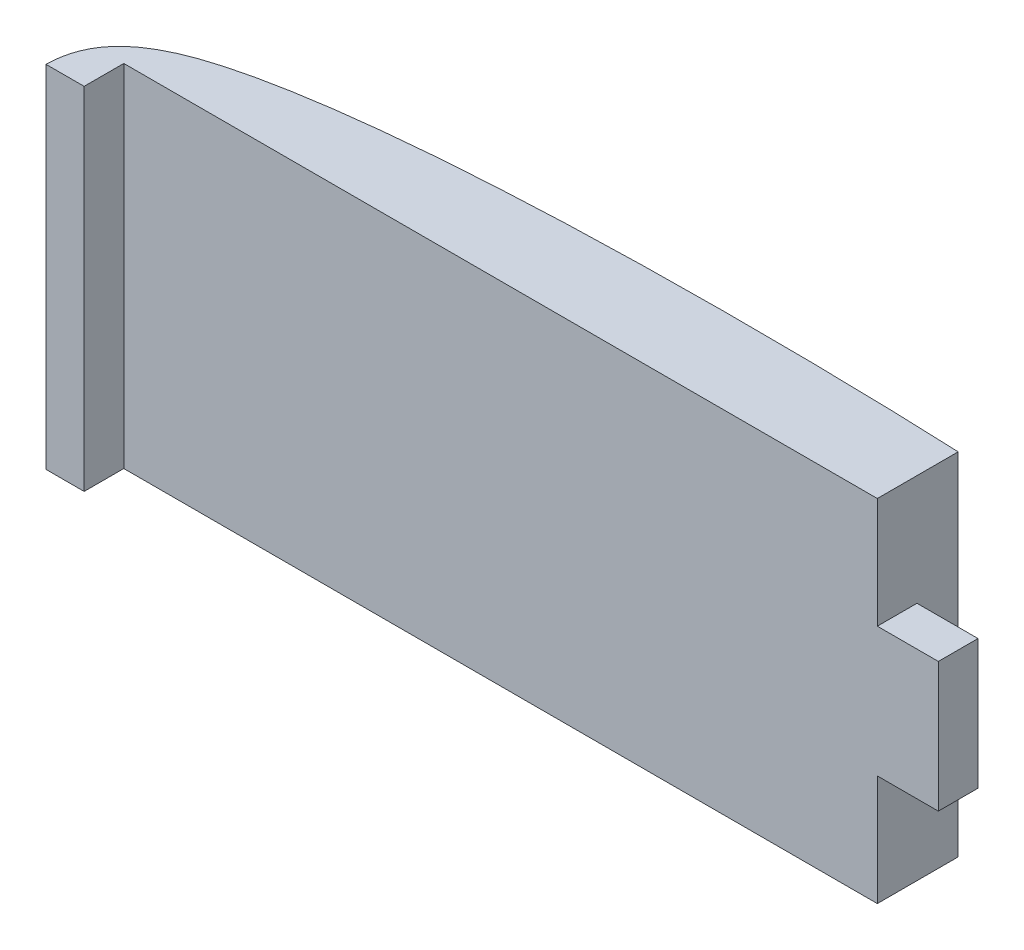
ISO-10303-21;
HEADER;
FILE_DESCRIPTION(('STEP AP214'),'2;1');
FILE_NAME('part.step','',(''),(''),'','','');
FILE_SCHEMA(('AUTOMOTIVE_DESIGN { 1 0 10303 214 1 1 1 1 }'));
ENDSEC;
DATA;
#1=APPLICATION_CONTEXT('core data for automotive mechanical design processes');
#2=APPLICATION_PROTOCOL_DEFINITION('international standard','automotive_design',2000,#1);
#3=PRODUCT_CONTEXT('',#1,'mechanical');
#4=PRODUCT('Part','Part','',(#3));
#5=PRODUCT_RELATED_PRODUCT_CATEGORY('part','',(#4));
#6=PRODUCT_DEFINITION_FORMATION('','',#4);
#7=PRODUCT_DEFINITION_CONTEXT('part definition',#1,'design');
#8=PRODUCT_DEFINITION('design','',#6,#7);
#9=PRODUCT_DEFINITION_SHAPE('','',#8);
#10=(LENGTH_UNIT() NAMED_UNIT(*) SI_UNIT(.MILLI.,.METRE.));
#11=(NAMED_UNIT(*) PLANE_ANGLE_UNIT() SI_UNIT($,.RADIAN.));
#12=(NAMED_UNIT(*) SI_UNIT($,.STERADIAN.) SOLID_ANGLE_UNIT());
#13=UNCERTAINTY_MEASURE_WITH_UNIT(LENGTH_MEASURE(1.E-05),#10,'distance_accuracy_value','');
#14=(GEOMETRIC_REPRESENTATION_CONTEXT(3) GLOBAL_UNCERTAINTY_ASSIGNED_CONTEXT((#13)) GLOBAL_UNIT_ASSIGNED_CONTEXT((#10,
#11,#12)) REPRESENTATION_CONTEXT('',''));
#15=CARTESIAN_POINT('',(0.,0.,0.));
#16=DIRECTION('',(0.,0.,1.));
#17=DIRECTION('',(1.,0.,0.));
#18=AXIS2_PLACEMENT_3D('',#15,#16,#17);
#19=CARTESIAN_POINT('',(0.,23.,0.));
#20=DIRECTION('',(-1.,0.,0.));
#21=DIRECTION('',(0.,0.,1.));
#22=AXIS2_PLACEMENT_3D('',#19,#20,#21);
#23=PLANE('',#22);
#24=DIRECTION('',(0.,0.,1.));
#25=VECTOR('',#24,1.);
#26=CARTESIAN_POINT('',(0.,15.75,-2.6));
#27=LINE('',#26,#25);
#28=CARTESIAN_POINT('',(0.,15.75,-2.6));
#29=VERTEX_POINT('',#28);
#30=CARTESIAN_POINT('',(0.,15.75,0.));
#31=VERTEX_POINT('',#30);
#32=EDGE_CURVE('E49',#29,#31,#27,.T.);
#33=ORIENTED_EDGE('',*,*,#32,.F.);
#34=DIRECTION('',(0.,1.,0.));
#35=VECTOR('',#34,1.);
#36=CARTESIAN_POINT('',(0.,7.25,-2.6));
#37=LINE('',#36,#35);
#38=CARTESIAN_POINT('',(0.,7.25,-2.6));
#39=VERTEX_POINT('',#38);
#40=EDGE_CURVE('E124',#39,#29,#37,.T.);
#41=ORIENTED_EDGE('',*,*,#40,.F.);
#42=DIRECTION('',(0.,0.,-1.));
#43=VECTOR('',#42,1.);
#44=CARTESIAN_POINT('',(0.,7.25,0.));
#45=LINE('',#44,#43);
#46=CARTESIAN_POINT('',(0.,7.25,0.));
#47=VERTEX_POINT('',#46);
#48=EDGE_CURVE('E55',#47,#39,#45,.T.);
#49=ORIENTED_EDGE('',*,*,#48,.F.);
#50=DIRECTION('',(0.,-1.,0.));
#51=VECTOR('',#50,1.);
#52=CARTESIAN_POINT('',(0.,23.,0.));
#53=LINE('',#52,#51);
#54=CARTESIAN_POINT('',(0.,0.,0.));
#55=VERTEX_POINT('',#54);
#56=EDGE_CURVE('E43',#47,#55,#53,.T.);
#57=ORIENTED_EDGE('',*,*,#56,.T.);
#58=DIRECTION('',(0.,0.,-1.));
#59=VECTOR('',#58,1.);
#60=CARTESIAN_POINT('',(0.,0.,0.));
#61=LINE('',#60,#59);
#62=CARTESIAN_POINT('',(0.,0.,-5.3));
#63=VERTEX_POINT('',#62);
#64=EDGE_CURVE('E129',#55,#63,#61,.T.);
#65=ORIENTED_EDGE('',*,*,#64,.T.);
#66=DIRECTION('',(0.,-1.,0.));
#67=VECTOR('',#66,1.);
#68=CARTESIAN_POINT('',(0.,23.,-5.3));
#69=LINE('',#68,#67);
#70=CARTESIAN_POINT('',(0.,23.,-5.3));
#71=VERTEX_POINT('',#70);
#72=EDGE_CURVE('E283',#71,#63,#69,.T.);
#73=ORIENTED_EDGE('',*,*,#72,.F.);
#74=DIRECTION('',(0.,0.,-1.));
#75=VECTOR('',#74,1.);
#76=CARTESIAN_POINT('',(0.,23.,0.));
#77=LINE('',#76,#75);
#78=CARTESIAN_POINT('',(0.,23.,0.));
#79=VERTEX_POINT('',#78);
#80=EDGE_CURVE('E138',#79,#71,#77,.T.);
#81=ORIENTED_EDGE('',*,*,#80,.F.);
#82=EDGE_CURVE('E11',#79,#31,#53,.T.);
#83=ORIENTED_EDGE('',*,*,#82,.T.);
#84=EDGE_LOOP('',(#33,#41,#49,#57,#65,#73,#81,#83));
#85=FACE_BOUND('',#84,.T.);
#86=ADVANCED_FACE('F35',(#85),#23,.F.);
#87=CARTESIAN_POINT('',(0.,23.,0.));
#88=DIRECTION('',(0.,0.,-1.));
#89=DIRECTION('',(-1.,0.,0.));
#90=AXIS2_PLACEMENT_3D('',#87,#88,#89);
#91=PLANE('',#90);
#92=DIRECTION('',(1.,0.,0.));
#93=VECTOR('',#92,1.);
#94=CARTESIAN_POINT('',(0.,0.,0.));
#95=LINE('',#94,#93);
#96=CARTESIAN_POINT('',(-49.4,0.,0.));
#97=VERTEX_POINT('',#96);
#98=EDGE_CURVE('E127',#97,#55,#95,.T.);
#99=ORIENTED_EDGE('',*,*,#98,.T.);
#100=ORIENTED_EDGE('',*,*,#56,.F.);
#101=DIRECTION('',(-1.,0.,0.));
#102=VECTOR('',#101,1.);
#103=CARTESIAN_POINT('',(4.,7.25,0.));
#104=LINE('',#103,#102);
#105=CARTESIAN_POINT('',(4.,7.25,0.));
#106=VERTEX_POINT('',#105);
#107=EDGE_CURVE('E111',#106,#47,#104,.T.);
#108=ORIENTED_EDGE('',*,*,#107,.F.);
#109=DIRECTION('',(0.,-1.,0.));
#110=VECTOR('',#109,1.);
#111=CARTESIAN_POINT('',(4.,15.75,0.));
#112=LINE('',#111,#110);
#113=CARTESIAN_POINT('',(4.,15.75,0.));
#114=VERTEX_POINT('',#113);
#115=EDGE_CURVE('E104',#114,#106,#112,.T.);
#116=ORIENTED_EDGE('',*,*,#115,.F.);
#117=DIRECTION('',(-1.,0.,0.));
#118=VECTOR('',#117,1.);
#119=CARTESIAN_POINT('',(4.,15.75,0.));
#120=LINE('',#119,#118);
#121=EDGE_CURVE('E109',#114,#31,#120,.T.);
#122=ORIENTED_EDGE('',*,*,#121,.T.);
#123=ORIENTED_EDGE('',*,*,#82,.F.);
#124=DIRECTION('',(1.,0.,0.));
#125=VECTOR('',#124,1.);
#126=CARTESIAN_POINT('',(0.,23.,0.));
#127=LINE('',#126,#125);
#128=CARTESIAN_POINT('',(-49.4,23.,0.));
#129=VERTEX_POINT('',#128);
#130=EDGE_CURVE('E135',#129,#79,#127,.T.);
#131=ORIENTED_EDGE('',*,*,#130,.F.);
#132=DIRECTION('',(0.,-1.,0.));
#133=VECTOR('',#132,1.);
#134=CARTESIAN_POINT('',(-49.4,23.,0.));
#135=LINE('',#134,#133);
#136=EDGE_CURVE('E271',#129,#97,#135,.T.);
#137=ORIENTED_EDGE('',*,*,#136,.T.);
#138=EDGE_LOOP('',(#99,#100,#108,#116,#122,#123,#131,#137));
#139=FACE_BOUND('',#138,.T.);
#140=ADVANCED_FACE('F37',(#139),#91,.F.);
#141=CARTESIAN_POINT('',(0.,23.,-5.3));
#142=CARTESIAN_POINT('',(-7.99387446484531,23.,-5.66903910950247));
#143=CARTESIAN_POINT('',(-41.5732200263528,23.,-6.37256579237499));
#144=CARTESIAN_POINT('',(-51.8478477426027,23.,-0.984637076367036));
#145=CARTESIAN_POINT('',(-51.9,23.,2.60000000000009));
#146=B_SPLINE_CURVE_WITH_KNOTS('',3,(#141,#142,#143,#144,#145),.UNSPECIFIED.,.F.,.F.,(4,1,4),
(0.,0.717430519294495,1.),.UNSPECIFIED.);
#147=DIRECTION('',(0.,-1.,0.));
#148=VECTOR('',#147,1.);
#149=SURFACE_OF_LINEAR_EXTRUSION('',#146,#148);
#150=CARTESIAN_POINT('',(0.,0.,-5.3));
#151=CARTESIAN_POINT('',(-7.99387446484531,0.,-5.66903910950247));
#152=CARTESIAN_POINT('',(-41.5732200263528,0.,-6.37256579237499));
#153=CARTESIAN_POINT('',(-51.8478477426027,0.,-0.984637076367036));
#154=CARTESIAN_POINT('',(-51.9,0.,2.60000000000009));
#155=B_SPLINE_CURVE_WITH_KNOTS('',3,(#150,#151,#152,#153,#154),.UNSPECIFIED.,.F.,.F.,(4,1,4),
(0.,0.717430519294495,1.),.UNSPECIFIED.);
#156=CARTESIAN_POINT('',(-51.9,0.,2.60000000000009));
#157=VERTEX_POINT('',#156);
#158=EDGE_CURVE('E287',#63,#157,#155,.T.);
#159=ORIENTED_EDGE('',*,*,#158,.T.);
#160=DIRECTION('',(0.,-1.,0.));
#161=VECTOR('',#160,1.);
#162=CARTESIAN_POINT('',(-51.9,23.,2.60000000000009));
#163=LINE('',#162,#161);
#164=CARTESIAN_POINT('',(-51.9,23.,2.60000000000009));
#165=VERTEX_POINT('',#164);
#166=EDGE_CURVE('E277',#165,#157,#163,.T.);
#167=ORIENTED_EDGE('',*,*,#166,.F.);
#168=EDGE_CURVE('E141',#71,#165,#146,.T.);
#169=ORIENTED_EDGE('',*,*,#168,.F.);
#170=ORIENTED_EDGE('',*,*,#72,.T.);
#171=EDGE_LOOP('',(#159,#167,#169,#170));
#172=FACE_BOUND('',#171,.T.);
#173=ADVANCED_FACE('F152',(#172),#149,.F.);
#174=CARTESIAN_POINT('',(-49.4,23.,2.6));
#175=DIRECTION('',(0.,0.,-1.));
#176=DIRECTION('',(-1.,0.,0.));
#177=AXIS2_PLACEMENT_3D('',#174,#175,#176);
#178=PLANE('',#177);
#179=DIRECTION('',(1.,0.,0.));
#180=VECTOR('',#179,1.);
#181=CARTESIAN_POINT('',(-49.4,0.,2.6));
#182=LINE('',#181,#180);
#183=CARTESIAN_POINT('',(-49.4,0.,2.6));
#184=VERTEX_POINT('',#183);
#185=EDGE_CURVE('E289',#157,#184,#182,.T.);
#186=ORIENTED_EDGE('',*,*,#185,.T.);
#187=DIRECTION('',(0.,-1.,0.));
#188=VECTOR('',#187,1.);
#189=CARTESIAN_POINT('',(-49.4,23.,2.6));
#190=LINE('',#189,#188);
#191=CARTESIAN_POINT('',(-49.4,23.,2.6));
#192=VERTEX_POINT('',#191);
#193=EDGE_CURVE('E273',#192,#184,#190,.T.);
#194=ORIENTED_EDGE('',*,*,#193,.F.);
#195=DIRECTION('',(1.,0.,0.));
#196=VECTOR('',#195,1.);
#197=CARTESIAN_POINT('',(-49.4,23.,2.6));
#198=LINE('',#197,#196);
#199=EDGE_CURVE('E146',#165,#192,#198,.T.);
#200=ORIENTED_EDGE('',*,*,#199,.F.);
#201=ORIENTED_EDGE('',*,*,#166,.T.);
#202=EDGE_LOOP('',(#186,#194,#200,#201));
#203=FACE_BOUND('',#202,.T.);
#204=ADVANCED_FACE('F155',(#203),#178,.F.);
#205=CARTESIAN_POINT('',(-49.4,23.,0.));
#206=DIRECTION('',(-1.,0.,0.));
#207=DIRECTION('',(0.,0.,1.));
#208=AXIS2_PLACEMENT_3D('',#205,#206,#207);
#209=PLANE('',#208);
#210=DIRECTION('',(0.,0.,-1.));
#211=VECTOR('',#210,1.);
#212=CARTESIAN_POINT('',(-49.4,0.,0.));
#213=LINE('',#212,#211);
#214=EDGE_CURVE('E139',#184,#97,#213,.T.);
#215=ORIENTED_EDGE('',*,*,#214,.T.);
#216=ORIENTED_EDGE('',*,*,#136,.F.);
#217=DIRECTION('',(0.,0.,-1.));
#218=VECTOR('',#217,1.);
#219=CARTESIAN_POINT('',(-49.4,23.,0.));
#220=LINE('',#219,#218);
#221=EDGE_CURVE('E274',#192,#129,#220,.T.);
#222=ORIENTED_EDGE('',*,*,#221,.F.);
#223=ORIENTED_EDGE('',*,*,#193,.T.);
#224=EDGE_LOOP('',(#215,#216,#222,#223));
#225=FACE_BOUND('',#224,.T.);
#226=ADVANCED_FACE('F175',(#225),#209,.F.);
#227=CARTESIAN_POINT('',(-30.6596878631715,23.,-5.16204294580185));
#228=DIRECTION('',(0.,-1.,0.));
#229=DIRECTION('',(0.,0.,-1.));
#230=AXIS2_PLACEMENT_3D('',#227,#228,#229);
#231=PLANE('',#230);
#232=ORIENTED_EDGE('',*,*,#130,.T.);
#233=ORIENTED_EDGE('',*,*,#80,.T.);
#234=ORIENTED_EDGE('',*,*,#168,.T.);
#235=ORIENTED_EDGE('',*,*,#199,.T.);
#236=ORIENTED_EDGE('',*,*,#221,.T.);
#237=EDGE_LOOP('',(#232,#233,#234,#235,#236));
#238=FACE_BOUND('',#237,.T.);
#239=ADVANCED_FACE('F182',(#238),#231,.F.);
#240=CARTESIAN_POINT('',(-30.6596878631715,0.,-5.16204294580185));
#241=DIRECTION('',(0.,-1.,0.));
#242=DIRECTION('',(0.,0.,-1.));
#243=AXIS2_PLACEMENT_3D('',#240,#241,#242);
#244=PLANE('',#243);
#245=ORIENTED_EDGE('',*,*,#98,.F.);
#246=ORIENTED_EDGE('',*,*,#214,.F.);
#247=ORIENTED_EDGE('',*,*,#185,.F.);
#248=ORIENTED_EDGE('',*,*,#158,.F.);
#249=ORIENTED_EDGE('',*,*,#64,.F.);
#250=EDGE_LOOP('',(#245,#246,#247,#248,#249));
#251=FACE_BOUND('',#250,.T.);
#252=ADVANCED_FACE('F189',(#251),#244,.T.);
#253=CARTESIAN_POINT('',(4.,15.75,-2.6));
#254=DIRECTION('',(0.,-1.,0.));
#255=DIRECTION('',(0.,0.,-1.));
#256=AXIS2_PLACEMENT_3D('',#253,#254,#255);
#257=PLANE('',#256);
#258=ORIENTED_EDGE('',*,*,#32,.T.);
#259=ORIENTED_EDGE('',*,*,#121,.F.);
#260=DIRECTION('',(0.,0.,1.));
#261=VECTOR('',#260,1.);
#262=CARTESIAN_POINT('',(4.,15.75,-2.6));
#263=LINE('',#262,#261);
#264=CARTESIAN_POINT('',(4.,15.75,-2.6));
#265=VERTEX_POINT('',#264);
#266=EDGE_CURVE('E115',#265,#114,#263,.T.);
#267=ORIENTED_EDGE('',*,*,#266,.F.);
#268=DIRECTION('',(-1.,0.,0.));
#269=VECTOR('',#268,1.);
#270=CARTESIAN_POINT('',(4.,15.75,-2.6));
#271=LINE('',#270,#269);
#272=EDGE_CURVE('E255',#265,#29,#271,.T.);
#273=ORIENTED_EDGE('',*,*,#272,.T.);
#274=EDGE_LOOP('',(#258,#259,#267,#273));
#275=FACE_BOUND('',#274,.T.);
#276=ADVANCED_FACE('F126',(#275),#257,.F.);
#277=CARTESIAN_POINT('',(4.,7.25,0.));
#278=DIRECTION('',(0.,1.,0.));
#279=DIRECTION('',(0.,0.,1.));
#280=AXIS2_PLACEMENT_3D('',#277,#278,#279);
#281=PLANE('',#280);
#282=ORIENTED_EDGE('',*,*,#48,.T.);
#283=DIRECTION('',(-1.,0.,0.));
#284=VECTOR('',#283,1.);
#285=CARTESIAN_POINT('',(4.,7.25,-2.6));
#286=LINE('',#285,#284);
#287=CARTESIAN_POINT('',(4.,7.25,-2.6));
#288=VERTEX_POINT('',#287);
#289=EDGE_CURVE('E131',#288,#39,#286,.T.);
#290=ORIENTED_EDGE('',*,*,#289,.F.);
#291=DIRECTION('',(0.,0.,-1.));
#292=VECTOR('',#291,1.);
#293=CARTESIAN_POINT('',(4.,7.25,0.));
#294=LINE('',#293,#292);
#295=EDGE_CURVE('E114',#106,#288,#294,.T.);
#296=ORIENTED_EDGE('',*,*,#295,.F.);
#297=ORIENTED_EDGE('',*,*,#107,.T.);
#298=EDGE_LOOP('',(#282,#290,#296,#297));
#299=FACE_BOUND('',#298,.T.);
#300=ADVANCED_FACE('F203',(#299),#281,.F.);
#301=CARTESIAN_POINT('',(4.,7.25,-2.6));
#302=DIRECTION('',(0.,0.,1.));
#303=DIRECTION('',(1.,0.,0.));
#304=AXIS2_PLACEMENT_3D('',#301,#302,#303);
#305=PLANE('',#304);
#306=ORIENTED_EDGE('',*,*,#40,.T.);
#307=ORIENTED_EDGE('',*,*,#272,.F.);
#308=DIRECTION('',(0.,1.,0.));
#309=VECTOR('',#308,1.);
#310=CARTESIAN_POINT('',(4.,7.25,-2.6));
#311=LINE('',#310,#309);
#312=EDGE_CURVE('E120',#288,#265,#311,.T.);
#313=ORIENTED_EDGE('',*,*,#312,.F.);
#314=ORIENTED_EDGE('',*,*,#289,.T.);
#315=EDGE_LOOP('',(#306,#307,#313,#314));
#316=FACE_BOUND('',#315,.T.);
#317=ADVANCED_FACE('F210',(#316),#305,.F.);
#318=CARTESIAN_POINT('',(4.,0.,0.));
#319=DIRECTION('',(1.,0.,0.));
#320=DIRECTION('',(0.,0.,-1.));
#321=AXIS2_PLACEMENT_3D('',#318,#319,#320);
#322=PLANE('',#321);
#323=ORIENTED_EDGE('',*,*,#266,.T.);
#324=ORIENTED_EDGE('',*,*,#115,.T.);
#325=ORIENTED_EDGE('',*,*,#295,.T.);
#326=ORIENTED_EDGE('',*,*,#312,.T.);
#327=EDGE_LOOP('',(#323,#324,#325,#326));
#328=FACE_BOUND('',#327,.T.);
#329=ADVANCED_FACE('F118',(#328),#322,.T.);
#330=CLOSED_SHELL('',(#86,#140,#173,#204,#226,#239,#252,#276,#300,#317,#329));
#331=MANIFOLD_SOLID_BREP('B2',#330);
#332=ADVANCED_BREP_SHAPE_REPRESENTATION('',(#18,#331),#14);
#333=SHAPE_DEFINITION_REPRESENTATION(#9,#332);
ENDSEC;
END-ISO-10303-21;
